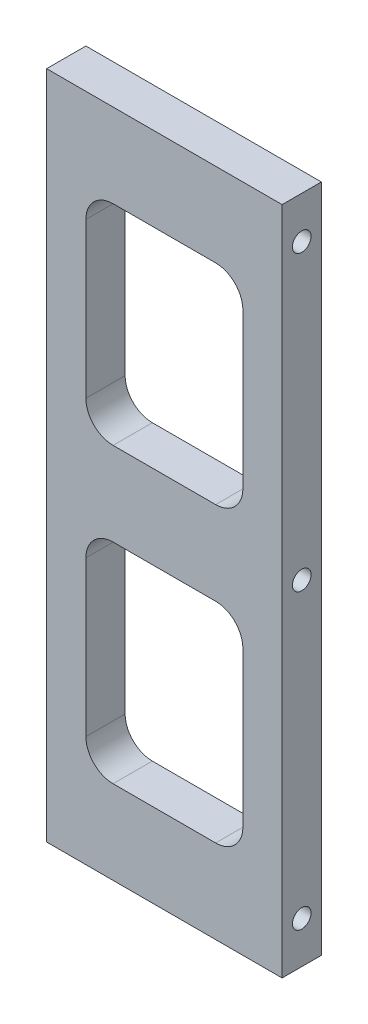
ISO-10303-21;
HEADER;
FILE_DESCRIPTION(('STEP AP214'),'2;1');
FILE_NAME('part.step','',(''),(''),'','','');
FILE_SCHEMA(('AUTOMOTIVE_DESIGN { 1 0 10303 214 1 1 1 1 }'));
ENDSEC;
DATA;
#1=APPLICATION_CONTEXT('core data for automotive mechanical design processes');
#2=APPLICATION_PROTOCOL_DEFINITION('international standard','automotive_design',2000,#1);
#3=PRODUCT_CONTEXT('',#1,'mechanical');
#4=PRODUCT('Part','Part','',(#3));
#5=PRODUCT_RELATED_PRODUCT_CATEGORY('part','',(#4));
#6=PRODUCT_DEFINITION_FORMATION('','',#4);
#7=PRODUCT_DEFINITION_CONTEXT('part definition',#1,'design');
#8=PRODUCT_DEFINITION('design','',#6,#7);
#9=PRODUCT_DEFINITION_SHAPE('','',#8);
#10=(LENGTH_UNIT() NAMED_UNIT(*) SI_UNIT(.MILLI.,.METRE.));
#11=(NAMED_UNIT(*) PLANE_ANGLE_UNIT() SI_UNIT($,.RADIAN.));
#12=(NAMED_UNIT(*) SI_UNIT($,.STERADIAN.) SOLID_ANGLE_UNIT());
#13=UNCERTAINTY_MEASURE_WITH_UNIT(LENGTH_MEASURE(1.E-05),#10,'distance_accuracy_value','');
#14=(GEOMETRIC_REPRESENTATION_CONTEXT(3) GLOBAL_UNCERTAINTY_ASSIGNED_CONTEXT((#13)) GLOBAL_UNIT_ASSIGNED_CONTEXT((#10,
#11,#12)) REPRESENTATION_CONTEXT('',''));
#15=CARTESIAN_POINT('',(0.,0.,0.));
#16=DIRECTION('',(0.,0.,1.));
#17=DIRECTION('',(1.,0.,0.));
#18=AXIS2_PLACEMENT_3D('',#15,#16,#17);
#19=CARTESIAN_POINT('',(14.2875,-40.64,4.7625));
#20=DIRECTION('',(-1.,0.,0.));
#21=DIRECTION('',(0.,0.,1.));
#22=AXIS2_PLACEMENT_3D('',#19,#20,#21);
#23=PLANE('',#22);
#24=CARTESIAN_POINT('',(14.2875,35.56,2.38125000000001));
#25=DIRECTION('',(1.,0.,0.));
#26=DIRECTION('',(0.,0.,-1.));
#27=AXIS2_PLACEMENT_3D('',#24,#25,#26);
#28=CIRCLE('',#27,1.13029999999999);
#29=CARTESIAN_POINT('',(14.2875,35.56,1.25095000000002));
#30=VERTEX_POINT('',#29);
#31=EDGE_CURVE('E423',#30,#30,#28,.T.);
#32=ORIENTED_EDGE('',*,*,#31,.F.);
#33=EDGE_LOOP('',(#32));
#34=FACE_BOUND('',#33,.T.);
#35=CARTESIAN_POINT('',(14.2875,0.,2.38125));
#36=DIRECTION('',(1.,0.,0.));
#37=DIRECTION('',(0.,0.,-1.));
#38=AXIS2_PLACEMENT_3D('',#35,#36,#37);
#39=CIRCLE('',#38,1.13029999999999);
#40=CARTESIAN_POINT('',(14.2875,0.,1.25095000000001));
#41=VERTEX_POINT('',#40);
#42=EDGE_CURVE('E418',#41,#41,#39,.T.);
#43=ORIENTED_EDGE('',*,*,#42,.F.);
#44=EDGE_LOOP('',(#43));
#45=FACE_BOUND('',#44,.T.);
#46=CARTESIAN_POINT('',(14.2875,-35.56,2.38125));
#47=DIRECTION('',(1.,0.,0.));
#48=DIRECTION('',(0.,0.,-1.));
#49=AXIS2_PLACEMENT_3D('',#46,#47,#48);
#50=CIRCLE('',#49,1.13029999999999);
#51=CARTESIAN_POINT('',(14.2875,-35.56,1.25095000000001));
#52=VERTEX_POINT('',#51);
#53=EDGE_CURVE('E412',#52,#52,#50,.T.);
#54=ORIENTED_EDGE('',*,*,#53,.F.);
#55=EDGE_LOOP('',(#54));
#56=FACE_BOUND('',#55,.T.);
#57=DIRECTION('',(0.,1.,0.));
#58=VECTOR('',#57,1.);
#59=CARTESIAN_POINT('',(14.2875,-40.64,0.));
#60=LINE('',#59,#58);
#61=CARTESIAN_POINT('',(14.2875,-40.64,0.));
#62=VERTEX_POINT('',#61);
#63=CARTESIAN_POINT('',(14.2875,40.64,0.));
#64=VERTEX_POINT('',#63);
#65=EDGE_CURVE('E196',#62,#64,#60,.T.);
#66=ORIENTED_EDGE('',*,*,#65,.T.);
#67=DIRECTION('',(0.,0.,-1.));
#68=VECTOR('',#67,1.);
#69=CARTESIAN_POINT('',(14.2875,40.64,4.7625));
#70=LINE('',#69,#68);
#71=CARTESIAN_POINT('',(14.2875,40.64,4.7625));
#72=VERTEX_POINT('',#71);
#73=EDGE_CURVE('E177',#72,#64,#70,.T.);
#74=ORIENTED_EDGE('',*,*,#73,.F.);
#75=DIRECTION('',(0.,1.,0.));
#76=VECTOR('',#75,1.);
#77=CARTESIAN_POINT('',(14.2875,-40.64,4.7625));
#78=LINE('',#77,#76);
#79=CARTESIAN_POINT('',(14.2875,-40.64,4.7625));
#80=VERTEX_POINT('',#79);
#81=EDGE_CURVE('E184',#80,#72,#78,.T.);
#82=ORIENTED_EDGE('',*,*,#81,.F.);
#83=DIRECTION('',(0.,0.,-1.));
#84=VECTOR('',#83,1.);
#85=CARTESIAN_POINT('',(14.2875,-40.64,4.7625));
#86=LINE('',#85,#84);
#87=EDGE_CURVE('E307',#80,#62,#86,.T.);
#88=ORIENTED_EDGE('',*,*,#87,.T.);
#89=EDGE_LOOP('',(#66,#74,#82,#88));
#90=FACE_BOUND('',#89,.T.);
#91=ADVANCED_FACE('F35',(#34,#45,#56,#90),#23,.F.);
#92=CARTESIAN_POINT('',(-14.2875,40.64,4.7625));
#93=DIRECTION('',(0.,-1.,0.));
#94=DIRECTION('',(0.,0.,-1.));
#95=AXIS2_PLACEMENT_3D('',#92,#93,#94);
#96=PLANE('',#95);
#97=DIRECTION('',(-1.,0.,0.));
#98=VECTOR('',#97,1.);
#99=CARTESIAN_POINT('',(-14.2875,40.64,0.));
#100=LINE('',#99,#98);
#101=CARTESIAN_POINT('',(-14.2875,40.64,0.));
#102=VERTEX_POINT('',#101);
#103=EDGE_CURVE('E309',#64,#102,#100,.T.);
#104=ORIENTED_EDGE('',*,*,#103,.T.);
#105=DIRECTION('',(0.,0.,-1.));
#106=VECTOR('',#105,1.);
#107=CARTESIAN_POINT('',(-14.2875,40.64,4.7625));
#108=LINE('',#107,#106);
#109=CARTESIAN_POINT('',(-14.2875,40.64,4.7625));
#110=VERTEX_POINT('',#109);
#111=EDGE_CURVE('E180',#110,#102,#108,.T.);
#112=ORIENTED_EDGE('',*,*,#111,.F.);
#113=DIRECTION('',(-1.,0.,0.));
#114=VECTOR('',#113,1.);
#115=CARTESIAN_POINT('',(-14.2875,40.64,4.7625));
#116=LINE('',#115,#114);
#117=EDGE_CURVE('E173',#72,#110,#116,.T.);
#118=ORIENTED_EDGE('',*,*,#117,.F.);
#119=ORIENTED_EDGE('',*,*,#73,.T.);
#120=EDGE_LOOP('',(#104,#112,#118,#119));
#121=FACE_BOUND('',#120,.T.);
#122=ADVANCED_FACE('F175',(#121),#96,.F.);
#123=CARTESIAN_POINT('',(-14.2875,-40.64,4.7625));
#124=DIRECTION('',(1.,0.,0.));
#125=DIRECTION('',(0.,0.,-1.));
#126=AXIS2_PLACEMENT_3D('',#123,#124,#125);
#127=PLANE('',#126);
#128=CARTESIAN_POINT('',(-14.2875,35.56,2.38125000000001));
#129=DIRECTION('',(1.,0.,0.));
#130=DIRECTION('',(0.,0.,-1.));
#131=AXIS2_PLACEMENT_3D('',#128,#129,#130);
#132=CIRCLE('',#131,1.13029999999999);
#133=CARTESIAN_POINT('',(-14.2875,35.56,1.25095000000002));
#134=VERTEX_POINT('',#133);
#135=EDGE_CURVE('E421',#134,#134,#132,.T.);
#136=ORIENTED_EDGE('',*,*,#135,.T.);
#137=EDGE_LOOP('',(#136));
#138=FACE_BOUND('',#137,.T.);
#139=CARTESIAN_POINT('',(-14.2875,0.,2.38125));
#140=DIRECTION('',(1.,0.,0.));
#141=DIRECTION('',(0.,0.,-1.));
#142=AXIS2_PLACEMENT_3D('',#139,#140,#141);
#143=CIRCLE('',#142,1.13029999999999);
#144=CARTESIAN_POINT('',(-14.2875,0.,1.25095000000001));
#145=VERTEX_POINT('',#144);
#146=EDGE_CURVE('E415',#145,#145,#143,.T.);
#147=ORIENTED_EDGE('',*,*,#146,.T.);
#148=EDGE_LOOP('',(#147));
#149=FACE_BOUND('',#148,.T.);
#150=CARTESIAN_POINT('',(-14.2875,-35.56,2.38125));
#151=DIRECTION('',(1.,0.,0.));
#152=DIRECTION('',(0.,0.,-1.));
#153=AXIS2_PLACEMENT_3D('',#150,#151,#152);
#154=CIRCLE('',#153,1.13029999999999);
#155=CARTESIAN_POINT('',(-14.2875,-35.56,1.25095000000001));
#156=VERTEX_POINT('',#155);
#157=EDGE_CURVE('E399',#156,#156,#154,.T.);
#158=ORIENTED_EDGE('',*,*,#157,.T.);
#159=EDGE_LOOP('',(#158));
#160=FACE_BOUND('',#159,.T.);
#161=DIRECTION('',(0.,-1.,0.));
#162=VECTOR('',#161,1.);
#163=CARTESIAN_POINT('',(-14.2875,-40.64,0.));
#164=LINE('',#163,#162);
#165=CARTESIAN_POINT('',(-14.2875,-40.64,0.));
#166=VERTEX_POINT('',#165);
#167=EDGE_CURVE('E311',#102,#166,#164,.T.);
#168=ORIENTED_EDGE('',*,*,#167,.T.);
#169=DIRECTION('',(0.,0.,-1.));
#170=VECTOR('',#169,1.);
#171=CARTESIAN_POINT('',(-14.2875,-40.64,4.7625));
#172=LINE('',#171,#170);
#173=CARTESIAN_POINT('',(-14.2875,-40.64,4.7625));
#174=VERTEX_POINT('',#173);
#175=EDGE_CURVE('E201',#174,#166,#172,.T.);
#176=ORIENTED_EDGE('',*,*,#175,.F.);
#177=DIRECTION('',(0.,-1.,0.));
#178=VECTOR('',#177,1.);
#179=CARTESIAN_POINT('',(-14.2875,-40.64,4.7625));
#180=LINE('',#179,#178);
#181=EDGE_CURVE('E183',#110,#174,#180,.T.);
#182=ORIENTED_EDGE('',*,*,#181,.F.);
#183=ORIENTED_EDGE('',*,*,#111,.T.);
#184=EDGE_LOOP('',(#168,#176,#182,#183));
#185=FACE_BOUND('',#184,.T.);
#186=ADVANCED_FACE('F321',(#138,#149,#160,#185),#127,.F.);
#187=CARTESIAN_POINT('',(-14.2875,-40.64,4.7625));
#188=DIRECTION('',(0.,1.,0.));
#189=DIRECTION('',(0.,0.,1.));
#190=AXIS2_PLACEMENT_3D('',#187,#188,#189);
#191=PLANE('',#190);
#192=DIRECTION('',(1.,0.,0.));
#193=VECTOR('',#192,1.);
#194=CARTESIAN_POINT('',(-14.2875,-40.64,0.));
#195=LINE('',#194,#193);
#196=EDGE_CURVE('E193',#166,#62,#195,.T.);
#197=ORIENTED_EDGE('',*,*,#196,.T.);
#198=ORIENTED_EDGE('',*,*,#87,.F.);
#199=DIRECTION('',(1.,0.,0.));
#200=VECTOR('',#199,1.);
#201=CARTESIAN_POINT('',(-14.2875,-40.64,4.7625));
#202=LINE('',#201,#200);
#203=EDGE_CURVE('E189',#174,#80,#202,.T.);
#204=ORIENTED_EDGE('',*,*,#203,.F.);
#205=ORIENTED_EDGE('',*,*,#175,.T.);
#206=EDGE_LOOP('',(#197,#198,#204,#205));
#207=FACE_BOUND('',#206,.T.);
#208=ADVANCED_FACE('F318',(#207),#191,.F.);
#209=CARTESIAN_POINT('',(0.,0.,4.7625));
#210=DIRECTION('',(0.,0.,-1.));
#211=DIRECTION('',(-1.,0.,0.));
#212=AXIS2_PLACEMENT_3D('',#209,#210,#211);
#213=PLANE('',#212);
#214=DIRECTION('',(1.,0.,0.));
#215=VECTOR('',#214,1.);
#216=CARTESIAN_POINT('',(-9.52500000000001,-30.48,4.7625));
#217=LINE('',#216,#215);
#218=CARTESIAN_POINT('',(-6.22300000000001,-30.48,4.7625));
#219=VERTEX_POINT('',#218);
#220=CARTESIAN_POINT('',(6.223,-30.48,4.7625));
#221=VERTEX_POINT('',#220);
#222=EDGE_CURVE('E393',#219,#221,#217,.T.);
#223=ORIENTED_EDGE('',*,*,#222,.F.);
#224=CARTESIAN_POINT('',(-6.22300000000001,-27.178,4.7625));
#225=DIRECTION('',(0.,0.,-1.));
#226=DIRECTION('',(-1.,0.,0.));
#227=AXIS2_PLACEMENT_3D('',#224,#225,#226);
#228=CIRCLE('',#227,3.302);
#229=CARTESIAN_POINT('',(-9.52500000000001,-27.178,4.7625));
#230=VERTEX_POINT('',#229);
#231=EDGE_CURVE('E241',#219,#230,#228,.T.);
#232=ORIENTED_EDGE('',*,*,#231,.T.);
#233=DIRECTION('',(0.,-1.,0.));
#234=VECTOR('',#233,1.);
#235=CARTESIAN_POINT('',(-9.52500000000001,-5.08,4.7625));
#236=LINE('',#235,#234);
#237=CARTESIAN_POINT('',(-9.52500000000001,-8.382,4.7625));
#238=VERTEX_POINT('',#237);
#239=EDGE_CURVE('E396',#238,#230,#236,.T.);
#240=ORIENTED_EDGE('',*,*,#239,.F.);
#241=CARTESIAN_POINT('',(-6.22300000000001,-8.382,4.7625));
#242=DIRECTION('',(0.,0.,-1.));
#243=DIRECTION('',(-1.,0.,0.));
#244=AXIS2_PLACEMENT_3D('',#241,#242,#243);
#245=CIRCLE('',#244,3.302);
#246=CARTESIAN_POINT('',(-6.22300000000001,-5.08,4.7625));
#247=VERTEX_POINT('',#246);
#248=EDGE_CURVE('E249',#238,#247,#245,.T.);
#249=ORIENTED_EDGE('',*,*,#248,.T.);
#250=DIRECTION('',(-1.,0.,0.));
#251=VECTOR('',#250,1.);
#252=CARTESIAN_POINT('',(-9.52500000000001,-5.08,4.7625));
#253=LINE('',#252,#251);
#254=CARTESIAN_POINT('',(6.22300000000001,-5.08,4.7625));
#255=VERTEX_POINT('',#254);
#256=EDGE_CURVE('E386',#255,#247,#253,.T.);
#257=ORIENTED_EDGE('',*,*,#256,.F.);
#258=CARTESIAN_POINT('',(6.22300000000001,-8.382,4.7625));
#259=DIRECTION('',(0.,0.,-1.));
#260=DIRECTION('',(-1.,0.,0.));
#261=AXIS2_PLACEMENT_3D('',#258,#259,#260);
#262=CIRCLE('',#261,3.302);
#263=CARTESIAN_POINT('',(9.52500000000001,-8.382,4.7625));
#264=VERTEX_POINT('',#263);
#265=EDGE_CURVE('E253',#255,#264,#262,.T.);
#266=ORIENTED_EDGE('',*,*,#265,.T.);
#267=DIRECTION('',(0.,1.,0.));
#268=VECTOR('',#267,1.);
#269=CARTESIAN_POINT('',(9.52500000000001,-5.08,4.7625));
#270=LINE('',#269,#268);
#271=CARTESIAN_POINT('',(9.52500000000001,-27.178,4.7625));
#272=VERTEX_POINT('',#271);
#273=EDGE_CURVE('E390',#272,#264,#270,.T.);
#274=ORIENTED_EDGE('',*,*,#273,.F.);
#275=CARTESIAN_POINT('',(6.22300000000001,-27.178,4.7625));
#276=DIRECTION('',(0.,0.,-1.));
#277=DIRECTION('',(-1.,0.,0.));
#278=AXIS2_PLACEMENT_3D('',#275,#276,#277);
#279=CIRCLE('',#278,3.302);
#280=EDGE_CURVE('E245',#272,#221,#279,.T.);
#281=ORIENTED_EDGE('',*,*,#280,.T.);
#282=EDGE_LOOP('',(#223,#232,#240,#249,#257,#266,#274,#281));
#283=FACE_BOUND('',#282,.T.);
#284=DIRECTION('',(-1.,0.,0.));
#285=VECTOR('',#284,1.);
#286=CARTESIAN_POINT('',(-9.52500000000001,30.48,4.7625));
#287=LINE('',#286,#285);
#288=CARTESIAN_POINT('',(6.223,30.48,4.7625));
#289=VERTEX_POINT('',#288);
#290=CARTESIAN_POINT('',(-6.22300000000001,30.48,4.7625));
#291=VERTEX_POINT('',#290);
#292=EDGE_CURVE('E270',#289,#291,#287,.T.);
#293=ORIENTED_EDGE('',*,*,#292,.F.);
#294=CARTESIAN_POINT('',(6.223,27.178,4.7625));
#295=DIRECTION('',(0.,0.,-1.));
#296=DIRECTION('',(-1.,0.,0.));
#297=AXIS2_PLACEMENT_3D('',#294,#295,#296);
#298=CIRCLE('',#297,3.302);
#299=CARTESIAN_POINT('',(9.52500000000001,27.178,4.7625));
#300=VERTEX_POINT('',#299);
#301=EDGE_CURVE('E265',#289,#300,#298,.T.);
#302=ORIENTED_EDGE('',*,*,#301,.T.);
#303=DIRECTION('',(0.,1.,0.));
#304=VECTOR('',#303,1.);
#305=CARTESIAN_POINT('',(9.52500000000001,5.08,4.7625));
#306=LINE('',#305,#304);
#307=CARTESIAN_POINT('',(9.52500000000001,8.382,4.7625));
#308=VERTEX_POINT('',#307);
#309=EDGE_CURVE('E277',#308,#300,#306,.T.);
#310=ORIENTED_EDGE('',*,*,#309,.F.);
#311=CARTESIAN_POINT('',(6.22300000000001,8.382,4.7625));
#312=DIRECTION('',(0.,0.,-1.));
#313=DIRECTION('',(-1.,0.,0.));
#314=AXIS2_PLACEMENT_3D('',#311,#312,#313);
#315=CIRCLE('',#314,3.302);
#316=CARTESIAN_POINT('',(6.22300000000001,5.08,4.7625));
#317=VERTEX_POINT('',#316);
#318=EDGE_CURVE('E261',#308,#317,#315,.T.);
#319=ORIENTED_EDGE('',*,*,#318,.T.);
#320=DIRECTION('',(1.,0.,0.));
#321=VECTOR('',#320,1.);
#322=CARTESIAN_POINT('',(-9.52500000000001,5.08,4.7625));
#323=LINE('',#322,#321);
#324=CARTESIAN_POINT('',(-6.22300000000001,5.08,4.7625));
#325=VERTEX_POINT('',#324);
#326=EDGE_CURVE('E302',#325,#317,#323,.T.);
#327=ORIENTED_EDGE('',*,*,#326,.F.);
#328=CARTESIAN_POINT('',(-6.22300000000001,8.382,4.7625));
#329=DIRECTION('',(0.,0.,-1.));
#330=DIRECTION('',(-1.,0.,0.));
#331=AXIS2_PLACEMENT_3D('',#328,#329,#330);
#332=CIRCLE('',#331,3.302);
#333=CARTESIAN_POINT('',(-9.52500000000001,8.382,4.7625));
#334=VERTEX_POINT('',#333);
#335=EDGE_CURVE('E257',#325,#334,#332,.T.);
#336=ORIENTED_EDGE('',*,*,#335,.T.);
#337=DIRECTION('',(0.,-1.,0.));
#338=VECTOR('',#337,1.);
#339=CARTESIAN_POINT('',(-9.52500000000001,5.08,4.7625));
#340=LINE('',#339,#338);
#341=CARTESIAN_POINT('',(-9.52500000000001,27.178,4.7625));
#342=VERTEX_POINT('',#341);
#343=EDGE_CURVE('E272',#342,#334,#340,.T.);
#344=ORIENTED_EDGE('',*,*,#343,.F.);
#345=CARTESIAN_POINT('',(-6.22300000000001,27.178,4.7625));
#346=DIRECTION('',(0.,0.,-1.));
#347=DIRECTION('',(-1.,0.,0.));
#348=AXIS2_PLACEMENT_3D('',#345,#346,#347);
#349=CIRCLE('',#348,3.302);
#350=EDGE_CURVE('E43',#342,#291,#349,.T.);
#351=ORIENTED_EDGE('',*,*,#350,.T.);
#352=EDGE_LOOP('',(#293,#302,#310,#319,#327,#336,#344,#351));
#353=FACE_BOUND('',#352,.T.);
#354=ORIENTED_EDGE('',*,*,#81,.T.);
#355=ORIENTED_EDGE('',*,*,#117,.T.);
#356=ORIENTED_EDGE('',*,*,#181,.T.);
#357=ORIENTED_EDGE('',*,*,#203,.T.);
#358=EDGE_LOOP('',(#354,#355,#356,#357));
#359=FACE_BOUND('',#358,.T.);
#360=ADVANCED_FACE('F187',(#283,#353,#359),#213,.F.);
#361=CARTESIAN_POINT('',(0.,0.,0.));
#362=DIRECTION('',(0.,0.,-1.));
#363=DIRECTION('',(-1.,0.,0.));
#364=AXIS2_PLACEMENT_3D('',#361,#362,#363);
#365=PLANE('',#364);
#366=DIRECTION('',(-1.,0.,0.));
#367=VECTOR('',#366,1.);
#368=CARTESIAN_POINT('',(-9.52500000000001,-5.08,0.));
#369=LINE('',#368,#367);
#370=CARTESIAN_POINT('',(6.22300000000001,-5.08,0.));
#371=VERTEX_POINT('',#370);
#372=CARTESIAN_POINT('',(-6.22300000000001,-5.08,0.));
#373=VERTEX_POINT('',#372);
#374=EDGE_CURVE('E299',#371,#373,#369,.T.);
#375=ORIENTED_EDGE('',*,*,#374,.T.);
#376=CARTESIAN_POINT('',(-6.22300000000001,-8.382,0.));
#377=DIRECTION('',(0.,0.,-1.));
#378=DIRECTION('',(-1.,0.,0.));
#379=AXIS2_PLACEMENT_3D('',#376,#377,#378);
#380=CIRCLE('',#379,3.302);
#381=CARTESIAN_POINT('',(-9.52500000000001,-8.382,0.));
#382=VERTEX_POINT('',#381);
#383=EDGE_CURVE('E251',#373,#382,#380,.F.);
#384=ORIENTED_EDGE('',*,*,#383,.T.);
#385=DIRECTION('',(0.,-1.,0.));
#386=VECTOR('',#385,1.);
#387=CARTESIAN_POINT('',(-9.52500000000001,-5.08,0.));
#388=LINE('',#387,#386);
#389=CARTESIAN_POINT('',(-9.52500000000001,-27.178,0.));
#390=VERTEX_POINT('',#389);
#391=EDGE_CURVE('E389',#382,#390,#388,.T.);
#392=ORIENTED_EDGE('',*,*,#391,.T.);
#393=CARTESIAN_POINT('',(-6.22300000000001,-27.178,0.));
#394=DIRECTION('',(0.,0.,-1.));
#395=DIRECTION('',(-1.,0.,0.));
#396=AXIS2_PLACEMENT_3D('',#393,#394,#395);
#397=CIRCLE('',#396,3.302);
#398=CARTESIAN_POINT('',(-6.22300000000001,-30.48,0.));
#399=VERTEX_POINT('',#398);
#400=EDGE_CURVE('E243',#390,#399,#397,.F.);
#401=ORIENTED_EDGE('',*,*,#400,.T.);
#402=DIRECTION('',(1.,0.,0.));
#403=VECTOR('',#402,1.);
#404=CARTESIAN_POINT('',(-9.52500000000001,-30.48,0.));
#405=LINE('',#404,#403);
#406=CARTESIAN_POINT('',(6.223,-30.48,0.));
#407=VERTEX_POINT('',#406);
#408=EDGE_CURVE('E405',#399,#407,#405,.T.);
#409=ORIENTED_EDGE('',*,*,#408,.T.);
#410=CARTESIAN_POINT('',(6.22300000000001,-27.178,0.));
#411=DIRECTION('',(0.,0.,-1.));
#412=DIRECTION('',(-1.,0.,0.));
#413=AXIS2_PLACEMENT_3D('',#410,#411,#412);
#414=CIRCLE('',#413,3.302);
#415=CARTESIAN_POINT('',(9.52500000000001,-27.178,0.));
#416=VERTEX_POINT('',#415);
#417=EDGE_CURVE('E247',#407,#416,#414,.F.);
#418=ORIENTED_EDGE('',*,*,#417,.T.);
#419=DIRECTION('',(0.,1.,0.));
#420=VECTOR('',#419,1.);
#421=CARTESIAN_POINT('',(9.52500000000001,-5.08,0.));
#422=LINE('',#421,#420);
#423=CARTESIAN_POINT('',(9.52500000000001,-8.382,0.));
#424=VERTEX_POINT('',#423);
#425=EDGE_CURVE('E402',#416,#424,#422,.T.);
#426=ORIENTED_EDGE('',*,*,#425,.T.);
#427=CARTESIAN_POINT('',(6.22300000000001,-8.382,0.));
#428=DIRECTION('',(0.,0.,-1.));
#429=DIRECTION('',(-1.,0.,0.));
#430=AXIS2_PLACEMENT_3D('',#427,#428,#429);
#431=CIRCLE('',#430,3.302);
#432=EDGE_CURVE('E255',#424,#371,#431,.F.);
#433=ORIENTED_EDGE('',*,*,#432,.T.);
#434=EDGE_LOOP('',(#375,#384,#392,#401,#409,#418,#426,#433));
#435=FACE_BOUND('',#434,.T.);
#436=DIRECTION('',(1.,0.,0.));
#437=VECTOR('',#436,1.);
#438=CARTESIAN_POINT('',(-9.52500000000001,5.08,0.));
#439=LINE('',#438,#437);
#440=CARTESIAN_POINT('',(-6.22300000000001,5.08,0.));
#441=VERTEX_POINT('',#440);
#442=CARTESIAN_POINT('',(6.22300000000001,5.08,0.));
#443=VERTEX_POINT('',#442);
#444=EDGE_CURVE('E291',#441,#443,#439,.T.);
#445=ORIENTED_EDGE('',*,*,#444,.T.);
#446=CARTESIAN_POINT('',(6.22300000000001,8.382,0.));
#447=DIRECTION('',(0.,0.,-1.));
#448=DIRECTION('',(-1.,0.,0.));
#449=AXIS2_PLACEMENT_3D('',#446,#447,#448);
#450=CIRCLE('',#449,3.302);
#451=CARTESIAN_POINT('',(9.52500000000001,8.382,0.));
#452=VERTEX_POINT('',#451);
#453=EDGE_CURVE('E263',#443,#452,#450,.F.);
#454=ORIENTED_EDGE('',*,*,#453,.T.);
#455=DIRECTION('',(0.,1.,0.));
#456=VECTOR('',#455,1.);
#457=CARTESIAN_POINT('',(9.52500000000001,5.08,0.));
#458=LINE('',#457,#456);
#459=CARTESIAN_POINT('',(9.52500000000001,27.178,0.));
#460=VERTEX_POINT('',#459);
#461=EDGE_CURVE('E294',#452,#460,#458,.T.);
#462=ORIENTED_EDGE('',*,*,#461,.T.);
#463=CARTESIAN_POINT('',(6.223,27.178,0.));
#464=DIRECTION('',(0.,0.,-1.));
#465=DIRECTION('',(-1.,0.,0.));
#466=AXIS2_PLACEMENT_3D('',#463,#464,#465);
#467=CIRCLE('',#466,3.302);
#468=CARTESIAN_POINT('',(6.223,30.48,0.));
#469=VERTEX_POINT('',#468);
#470=EDGE_CURVE('E57',#460,#469,#467,.F.);
#471=ORIENTED_EDGE('',*,*,#470,.T.);
#472=DIRECTION('',(-1.,0.,0.));
#473=VECTOR('',#472,1.);
#474=CARTESIAN_POINT('',(-9.52500000000001,30.48,0.));
#475=LINE('',#474,#473);
#476=CARTESIAN_POINT('',(-6.22300000000001,30.48,0.));
#477=VERTEX_POINT('',#476);
#478=EDGE_CURVE('E287',#469,#477,#475,.T.);
#479=ORIENTED_EDGE('',*,*,#478,.T.);
#480=CARTESIAN_POINT('',(-6.22300000000001,27.178,0.));
#481=DIRECTION('',(0.,0.,-1.));
#482=DIRECTION('',(-1.,0.,0.));
#483=AXIS2_PLACEMENT_3D('',#480,#481,#482);
#484=CIRCLE('',#483,3.302);
#485=CARTESIAN_POINT('',(-9.52500000000001,27.178,0.));
#486=VERTEX_POINT('',#485);
#487=EDGE_CURVE('E11',#477,#486,#484,.F.);
#488=ORIENTED_EDGE('',*,*,#487,.T.);
#489=DIRECTION('',(0.,-1.,0.));
#490=VECTOR('',#489,1.);
#491=CARTESIAN_POINT('',(-9.52500000000001,5.08,0.));
#492=LINE('',#491,#490);
#493=CARTESIAN_POINT('',(-9.52500000000001,8.382,0.));
#494=VERTEX_POINT('',#493);
#495=EDGE_CURVE('E285',#486,#494,#492,.T.);
#496=ORIENTED_EDGE('',*,*,#495,.T.);
#497=CARTESIAN_POINT('',(-6.22300000000001,8.382,0.));
#498=DIRECTION('',(0.,0.,-1.));
#499=DIRECTION('',(-1.,0.,0.));
#500=AXIS2_PLACEMENT_3D('',#497,#498,#499);
#501=CIRCLE('',#500,3.302);
#502=EDGE_CURVE('E259',#494,#441,#501,.F.);
#503=ORIENTED_EDGE('',*,*,#502,.T.);
#504=EDGE_LOOP('',(#445,#454,#462,#471,#479,#488,#496,#503));
#505=FACE_BOUND('',#504,.T.);
#506=ORIENTED_EDGE('',*,*,#65,.F.);
#507=ORIENTED_EDGE('',*,*,#196,.F.);
#508=ORIENTED_EDGE('',*,*,#167,.F.);
#509=ORIENTED_EDGE('',*,*,#103,.F.);
#510=EDGE_LOOP('',(#506,#507,#508,#509));
#511=FACE_BOUND('',#510,.T.);
#512=ADVANCED_FACE('F283',(#435,#505,#511),#365,.T.);
#513=CARTESIAN_POINT('',(9.52500000000001,5.08,0.));
#514=DIRECTION('',(1.,0.,0.));
#515=DIRECTION('',(0.,1.,0.));
#516=AXIS2_PLACEMENT_3D('',#513,#514,#515);
#517=PLANE('',#516);
#518=ORIENTED_EDGE('',*,*,#461,.F.);
#519=DIRECTION('',(0.,0.,1.));
#520=VECTOR('',#519,1.);
#521=CARTESIAN_POINT('',(9.52500000000001,8.382,4.7625));
#522=LINE('',#521,#520);
#523=EDGE_CURVE('E234',#452,#308,#522,.T.);
#524=ORIENTED_EDGE('',*,*,#523,.T.);
#525=ORIENTED_EDGE('',*,*,#309,.T.);
#526=DIRECTION('',(0.,0.,1.));
#527=VECTOR('',#526,1.);
#528=CARTESIAN_POINT('',(9.52500000000001,27.178,0.));
#529=LINE('',#528,#527);
#530=EDGE_CURVE('E232',#300,#460,#529,.F.);
#531=ORIENTED_EDGE('',*,*,#530,.T.);
#532=EDGE_LOOP('',(#518,#524,#525,#531));
#533=FACE_BOUND('',#532,.T.);
#534=ADVANCED_FACE('F376',(#533),#517,.F.);
#535=CARTESIAN_POINT('',(-9.52500000000001,5.08,0.));
#536=DIRECTION('',(0.,-1.,0.));
#537=DIRECTION('',(0.,0.,-1.));
#538=AXIS2_PLACEMENT_3D('',#535,#536,#537);
#539=PLANE('',#538);
#540=ORIENTED_EDGE('',*,*,#444,.F.);
#541=DIRECTION('',(0.,0.,1.));
#542=VECTOR('',#541,1.);
#543=CARTESIAN_POINT('',(-6.22300000000001,5.08,4.7625));
#544=LINE('',#543,#542);
#545=EDGE_CURVE('E224',#441,#325,#544,.T.);
#546=ORIENTED_EDGE('',*,*,#545,.T.);
#547=ORIENTED_EDGE('',*,*,#326,.T.);
#548=DIRECTION('',(0.,0.,1.));
#549=VECTOR('',#548,1.);
#550=CARTESIAN_POINT('',(6.22300000000001,5.08,0.));
#551=LINE('',#550,#549);
#552=EDGE_CURVE('E222',#317,#443,#551,.F.);
#553=ORIENTED_EDGE('',*,*,#552,.T.);
#554=EDGE_LOOP('',(#540,#546,#547,#553));
#555=FACE_BOUND('',#554,.T.);
#556=ADVANCED_FACE('F383',(#555),#539,.F.);
#557=CARTESIAN_POINT('',(-9.52500000000001,5.08,0.));
#558=DIRECTION('',(-1.,0.,0.));
#559=DIRECTION('',(0.,-1.,0.));
#560=AXIS2_PLACEMENT_3D('',#557,#558,#559);
#561=PLANE('',#560);
#562=ORIENTED_EDGE('',*,*,#343,.T.);
#563=DIRECTION('',(0.,0.,1.));
#564=VECTOR('',#563,1.);
#565=CARTESIAN_POINT('',(-9.52500000000001,8.382,0.));
#566=LINE('',#565,#564);
#567=EDGE_CURVE('E230',#334,#494,#566,.F.);
#568=ORIENTED_EDGE('',*,*,#567,.T.);
#569=ORIENTED_EDGE('',*,*,#495,.F.);
#570=DIRECTION('',(0.,0.,1.));
#571=VECTOR('',#570,1.);
#572=CARTESIAN_POINT('',(-9.52500000000001,27.178,4.7625));
#573=LINE('',#572,#571);
#574=EDGE_CURVE('E227',#486,#342,#573,.T.);
#575=ORIENTED_EDGE('',*,*,#574,.T.);
#576=EDGE_LOOP('',(#562,#568,#569,#575));
#577=FACE_BOUND('',#576,.T.);
#578=ADVANCED_FACE('F289',(#577),#561,.F.);
#579=CARTESIAN_POINT('',(-9.52500000000001,30.48,0.));
#580=DIRECTION('',(0.,1.,0.));
#581=DIRECTION('',(0.,0.,1.));
#582=AXIS2_PLACEMENT_3D('',#579,#580,#581);
#583=PLANE('',#582);
#584=ORIENTED_EDGE('',*,*,#478,.F.);
#585=DIRECTION('',(0.,0.,1.));
#586=VECTOR('',#585,1.);
#587=CARTESIAN_POINT('',(6.223,30.48,4.7625));
#588=LINE('',#587,#586);
#589=EDGE_CURVE('E238',#469,#289,#588,.T.);
#590=ORIENTED_EDGE('',*,*,#589,.T.);
#591=ORIENTED_EDGE('',*,*,#292,.T.);
#592=DIRECTION('',(0.,0.,1.));
#593=VECTOR('',#592,1.);
#594=CARTESIAN_POINT('',(-6.22300000000001,30.48,0.));
#595=LINE('',#594,#593);
#596=EDGE_CURVE('E50',#291,#477,#595,.F.);
#597=ORIENTED_EDGE('',*,*,#596,.T.);
#598=EDGE_LOOP('',(#584,#590,#591,#597));
#599=FACE_BOUND('',#598,.T.);
#600=ADVANCED_FACE('F275',(#599),#583,.F.);
#601=CARTESIAN_POINT('',(-9.52500000000001,-5.08,0.));
#602=DIRECTION('',(-1.,0.,0.));
#603=DIRECTION('',(0.,-1.,0.));
#604=AXIS2_PLACEMENT_3D('',#601,#602,#603);
#605=PLANE('',#604);
#606=ORIENTED_EDGE('',*,*,#239,.T.);
#607=DIRECTION('',(0.,0.,1.));
#608=VECTOR('',#607,1.);
#609=CARTESIAN_POINT('',(-9.52500000000001,-27.178,0.));
#610=LINE('',#609,#608);
#611=EDGE_CURVE('E210',#230,#390,#610,.F.);
#612=ORIENTED_EDGE('',*,*,#611,.T.);
#613=ORIENTED_EDGE('',*,*,#391,.F.);
#614=DIRECTION('',(0.,0.,1.));
#615=VECTOR('',#614,1.);
#616=CARTESIAN_POINT('',(-9.52500000000001,-8.382,4.7625));
#617=LINE('',#616,#615);
#618=EDGE_CURVE('E207',#382,#238,#617,.T.);
#619=ORIENTED_EDGE('',*,*,#618,.T.);
#620=EDGE_LOOP('',(#606,#612,#613,#619));
#621=FACE_BOUND('',#620,.T.);
#622=ADVANCED_FACE('F445',(#621),#605,.F.);
#623=CARTESIAN_POINT('',(-9.52500000000001,-5.08,0.));
#624=DIRECTION('',(0.,1.,0.));
#625=DIRECTION('',(0.,0.,1.));
#626=AXIS2_PLACEMENT_3D('',#623,#624,#625);
#627=PLANE('',#626);
#628=ORIENTED_EDGE('',*,*,#256,.T.);
#629=DIRECTION('',(0.,0.,1.));
#630=VECTOR('',#629,1.);
#631=CARTESIAN_POINT('',(-6.22300000000001,-5.08,0.));
#632=LINE('',#631,#630);
#633=EDGE_CURVE('E220',#247,#373,#632,.F.);
#634=ORIENTED_EDGE('',*,*,#633,.T.);
#635=ORIENTED_EDGE('',*,*,#374,.F.);
#636=DIRECTION('',(0.,0.,1.));
#637=VECTOR('',#636,1.);
#638=CARTESIAN_POINT('',(6.22300000000001,-5.08,4.7625));
#639=LINE('',#638,#637);
#640=EDGE_CURVE('E217',#371,#255,#639,.T.);
#641=ORIENTED_EDGE('',*,*,#640,.T.);
#642=EDGE_LOOP('',(#628,#634,#635,#641));
#643=FACE_BOUND('',#642,.T.);
#644=ADVANCED_FACE('F441',(#643),#627,.F.);
#645=CARTESIAN_POINT('',(9.52500000000001,-5.08,0.));
#646=DIRECTION('',(1.,0.,0.));
#647=DIRECTION('',(0.,0.,-1.));
#648=AXIS2_PLACEMENT_3D('',#645,#646,#647);
#649=PLANE('',#648);
#650=ORIENTED_EDGE('',*,*,#425,.F.);
#651=DIRECTION('',(0.,0.,1.));
#652=VECTOR('',#651,1.);
#653=CARTESIAN_POINT('',(9.52500000000001,-27.178,4.7625));
#654=LINE('',#653,#652);
#655=EDGE_CURVE('E214',#416,#272,#654,.T.);
#656=ORIENTED_EDGE('',*,*,#655,.T.);
#657=ORIENTED_EDGE('',*,*,#273,.T.);
#658=DIRECTION('',(0.,0.,1.));
#659=VECTOR('',#658,1.);
#660=CARTESIAN_POINT('',(9.52500000000001,-8.382,0.));
#661=LINE('',#660,#659);
#662=EDGE_CURVE('E212',#264,#424,#661,.F.);
#663=ORIENTED_EDGE('',*,*,#662,.T.);
#664=EDGE_LOOP('',(#650,#656,#657,#663));
#665=FACE_BOUND('',#664,.T.);
#666=ADVANCED_FACE('F444',(#665),#649,.F.);
#667=CARTESIAN_POINT('',(-9.52500000000001,-30.48,0.));
#668=DIRECTION('',(0.,-1.,0.));
#669=DIRECTION('',(0.,0.,-1.));
#670=AXIS2_PLACEMENT_3D('',#667,#668,#669);
#671=PLANE('',#670);
#672=ORIENTED_EDGE('',*,*,#408,.F.);
#673=DIRECTION('',(0.,0.,1.));
#674=VECTOR('',#673,1.);
#675=CARTESIAN_POINT('',(-6.22300000000001,-30.48,4.7625));
#676=LINE('',#675,#674);
#677=EDGE_CURVE('E199',#399,#219,#676,.T.);
#678=ORIENTED_EDGE('',*,*,#677,.T.);
#679=ORIENTED_EDGE('',*,*,#222,.T.);
#680=DIRECTION('',(0.,0.,1.));
#681=VECTOR('',#680,1.);
#682=CARTESIAN_POINT('',(6.22300000000001,-30.48,0.));
#683=LINE('',#682,#681);
#684=EDGE_CURVE('E197',#221,#407,#683,.F.);
#685=ORIENTED_EDGE('',*,*,#684,.T.);
#686=EDGE_LOOP('',(#672,#678,#679,#685));
#687=FACE_BOUND('',#686,.T.);
#688=ADVANCED_FACE('F345',(#687),#671,.F.);
#689=CARTESIAN_POINT('',(-6.22300000000001,-27.178,0.));
#690=DIRECTION('',(0.,0.,-1.));
#691=DIRECTION('',(-1.,0.,0.));
#692=AXIS2_PLACEMENT_3D('',#689,#690,#691);
#693=CYLINDRICAL_SURFACE('',#692,3.302);
#694=ORIENTED_EDGE('',*,*,#400,.F.);
#695=ORIENTED_EDGE('',*,*,#611,.F.);
#696=ORIENTED_EDGE('',*,*,#231,.F.);
#697=ORIENTED_EDGE('',*,*,#677,.F.);
#698=EDGE_LOOP('',(#694,#695,#696,#697));
#699=FACE_BOUND('',#698,.T.);
#700=ADVANCED_FACE('F341',(#699),#693,.F.);
#701=CARTESIAN_POINT('',(6.22300000000001,-27.178,0.));
#702=DIRECTION('',(0.,0.,-1.));
#703=DIRECTION('',(-1.,0.,0.));
#704=AXIS2_PLACEMENT_3D('',#701,#702,#703);
#705=CYLINDRICAL_SURFACE('',#704,3.302);
#706=ORIENTED_EDGE('',*,*,#417,.F.);
#707=ORIENTED_EDGE('',*,*,#684,.F.);
#708=ORIENTED_EDGE('',*,*,#280,.F.);
#709=ORIENTED_EDGE('',*,*,#655,.F.);
#710=EDGE_LOOP('',(#706,#707,#708,#709));
#711=FACE_BOUND('',#710,.T.);
#712=ADVANCED_FACE('F344',(#711),#705,.F.);
#713=CARTESIAN_POINT('',(-6.22300000000001,-8.382,0.));
#714=DIRECTION('',(0.,0.,-1.));
#715=DIRECTION('',(-1.,0.,0.));
#716=AXIS2_PLACEMENT_3D('',#713,#714,#715);
#717=CYLINDRICAL_SURFACE('',#716,3.302);
#718=ORIENTED_EDGE('',*,*,#383,.F.);
#719=ORIENTED_EDGE('',*,*,#633,.F.);
#720=ORIENTED_EDGE('',*,*,#248,.F.);
#721=ORIENTED_EDGE('',*,*,#618,.F.);
#722=EDGE_LOOP('',(#718,#719,#720,#721));
#723=FACE_BOUND('',#722,.T.);
#724=ADVANCED_FACE('F349',(#723),#717,.F.);
#725=CARTESIAN_POINT('',(6.22300000000001,-8.382,0.));
#726=DIRECTION('',(0.,0.,-1.));
#727=DIRECTION('',(-1.,0.,0.));
#728=AXIS2_PLACEMENT_3D('',#725,#726,#727);
#729=CYLINDRICAL_SURFACE('',#728,3.302);
#730=ORIENTED_EDGE('',*,*,#432,.F.);
#731=ORIENTED_EDGE('',*,*,#662,.F.);
#732=ORIENTED_EDGE('',*,*,#265,.F.);
#733=ORIENTED_EDGE('',*,*,#640,.F.);
#734=EDGE_LOOP('',(#730,#731,#732,#733));
#735=FACE_BOUND('',#734,.T.);
#736=ADVANCED_FACE('F353',(#735),#729,.F.);
#737=CARTESIAN_POINT('',(-6.22300000000001,8.382,0.));
#738=DIRECTION('',(0.,0.,-1.));
#739=DIRECTION('',(-1.,0.,0.));
#740=AXIS2_PLACEMENT_3D('',#737,#738,#739);
#741=CYLINDRICAL_SURFACE('',#740,3.302);
#742=ORIENTED_EDGE('',*,*,#502,.F.);
#743=ORIENTED_EDGE('',*,*,#567,.F.);
#744=ORIENTED_EDGE('',*,*,#335,.F.);
#745=ORIENTED_EDGE('',*,*,#545,.F.);
#746=EDGE_LOOP('',(#742,#743,#744,#745));
#747=FACE_BOUND('',#746,.T.);
#748=ADVANCED_FACE('F357',(#747),#741,.F.);
#749=CARTESIAN_POINT('',(6.22300000000001,8.382,0.));
#750=DIRECTION('',(0.,0.,-1.));
#751=DIRECTION('',(-1.,0.,0.));
#752=AXIS2_PLACEMENT_3D('',#749,#750,#751);
#753=CYLINDRICAL_SURFACE('',#752,3.302);
#754=ORIENTED_EDGE('',*,*,#453,.F.);
#755=ORIENTED_EDGE('',*,*,#552,.F.);
#756=ORIENTED_EDGE('',*,*,#318,.F.);
#757=ORIENTED_EDGE('',*,*,#523,.F.);
#758=EDGE_LOOP('',(#754,#755,#756,#757));
#759=FACE_BOUND('',#758,.T.);
#760=ADVANCED_FACE('F361',(#759),#753,.F.);
#761=CARTESIAN_POINT('',(6.223,27.178,0.));
#762=DIRECTION('',(0.,0.,-1.));
#763=DIRECTION('',(-1.,0.,0.));
#764=AXIS2_PLACEMENT_3D('',#761,#762,#763);
#765=CYLINDRICAL_SURFACE('',#764,3.302);
#766=ORIENTED_EDGE('',*,*,#470,.F.);
#767=ORIENTED_EDGE('',*,*,#530,.F.);
#768=ORIENTED_EDGE('',*,*,#301,.F.);
#769=ORIENTED_EDGE('',*,*,#589,.F.);
#770=EDGE_LOOP('',(#766,#767,#768,#769));
#771=FACE_BOUND('',#770,.T.);
#772=ADVANCED_FACE('F364',(#771),#765,.F.);
#773=CARTESIAN_POINT('',(-6.22300000000001,27.178,0.));
#774=DIRECTION('',(0.,0.,-1.));
#775=DIRECTION('',(-1.,0.,0.));
#776=AXIS2_PLACEMENT_3D('',#773,#774,#775);
#777=CYLINDRICAL_SURFACE('',#776,3.302);
#778=ORIENTED_EDGE('',*,*,#487,.F.);
#779=ORIENTED_EDGE('',*,*,#596,.F.);
#780=ORIENTED_EDGE('',*,*,#350,.F.);
#781=ORIENTED_EDGE('',*,*,#574,.F.);
#782=EDGE_LOOP('',(#778,#779,#780,#781));
#783=FACE_BOUND('',#782,.T.);
#784=ADVANCED_FACE('F37',(#783),#777,.F.);
#785=CARTESIAN_POINT('',(14.2875,-35.56,2.38125));
#786=DIRECTION('',(1.,0.,0.));
#787=DIRECTION('',(0.,0.,-1.));
#788=AXIS2_PLACEMENT_3D('',#785,#786,#787);
#789=CYLINDRICAL_SURFACE('',#788,1.13029999999999);
#790=ORIENTED_EDGE('',*,*,#157,.F.);
#791=EDGE_LOOP('',(#790));
#792=FACE_BOUND('',#791,.T.);
#793=ORIENTED_EDGE('',*,*,#53,.T.);
#794=EDGE_LOOP('',(#793));
#795=FACE_BOUND('',#794,.T.);
#796=ADVANCED_FACE('F371',(#792,#795),#789,.F.);
#797=CARTESIAN_POINT('',(14.2875,0.,2.38125));
#798=DIRECTION('',(1.,0.,0.));
#799=DIRECTION('',(0.,0.,-1.));
#800=AXIS2_PLACEMENT_3D('',#797,#798,#799);
#801=CYLINDRICAL_SURFACE('',#800,1.13029999999999);
#802=ORIENTED_EDGE('',*,*,#146,.F.);
#803=EDGE_LOOP('',(#802));
#804=FACE_BOUND('',#803,.T.);
#805=ORIENTED_EDGE('',*,*,#42,.T.);
#806=EDGE_LOOP('',(#805));
#807=FACE_BOUND('',#806,.T.);
#808=ADVANCED_FACE('F428',(#804,#807),#801,.F.);
#809=CARTESIAN_POINT('',(14.2875,35.56,2.38125000000001));
#810=DIRECTION('',(1.,0.,0.));
#811=DIRECTION('',(0.,0.,-1.));
#812=AXIS2_PLACEMENT_3D('',#809,#810,#811);
#813=CYLINDRICAL_SURFACE('',#812,1.13029999999999);
#814=ORIENTED_EDGE('',*,*,#135,.F.);
#815=EDGE_LOOP('',(#814));
#816=FACE_BOUND('',#815,.T.);
#817=ORIENTED_EDGE('',*,*,#31,.T.);
#818=EDGE_LOOP('',(#817));
#819=FACE_BOUND('',#818,.T.);
#820=ADVANCED_FACE('F426',(#816,#819),#813,.F.);
#821=CLOSED_SHELL('',(#91,#122,#186,#208,#360,#512,#534,#556,#578,#600,#622,#644,#666,#688,#700,
#712,#724,#736,#748,#760,#772,#784,#796,#808,#820));
#822=MANIFOLD_SOLID_BREP('B2',#821);
#823=ADVANCED_BREP_SHAPE_REPRESENTATION('',(#18,#822),#14);
#824=SHAPE_DEFINITION_REPRESENTATION(#9,#823);
ENDSEC;
END-ISO-10303-21;
